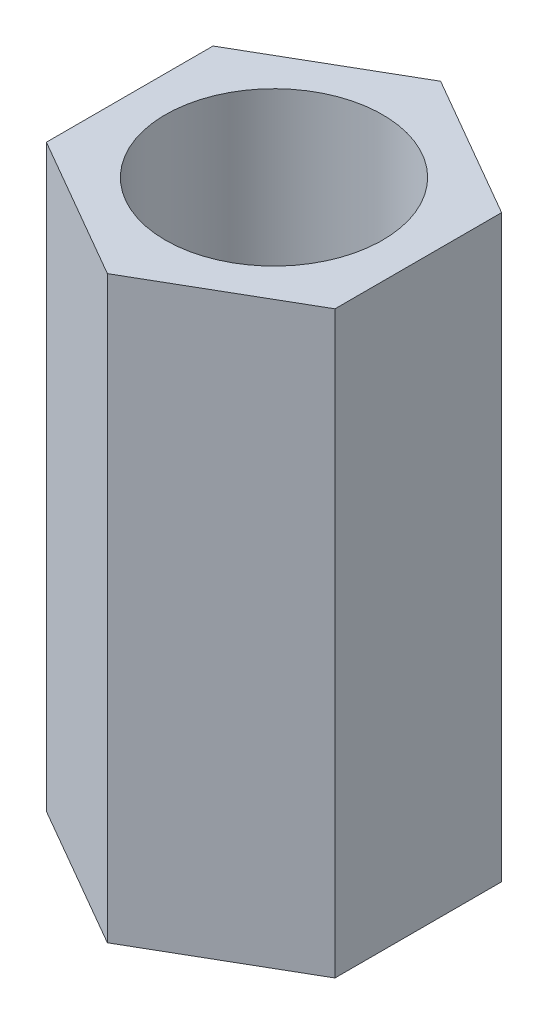
ISO-10303-21;
HEADER;
FILE_DESCRIPTION(('STEP AP214'),'2;1');
FILE_NAME('part.step','',(''),(''),'','','');
FILE_SCHEMA(('AUTOMOTIVE_DESIGN { 1 0 10303 214 1 1 1 1 }'));
ENDSEC;
DATA;
#1=APPLICATION_CONTEXT('core data for automotive mechanical design processes');
#2=APPLICATION_PROTOCOL_DEFINITION('international standard','automotive_design',2000,#1);
#3=PRODUCT_CONTEXT('',#1,'mechanical');
#4=PRODUCT('Part','Part','',(#3));
#5=PRODUCT_RELATED_PRODUCT_CATEGORY('part','',(#4));
#6=PRODUCT_DEFINITION_FORMATION('','',#4);
#7=PRODUCT_DEFINITION_CONTEXT('part definition',#1,'design');
#8=PRODUCT_DEFINITION('design','',#6,#7);
#9=PRODUCT_DEFINITION_SHAPE('','',#8);
#10=(LENGTH_UNIT() NAMED_UNIT(*) SI_UNIT(.MILLI.,.METRE.));
#11=(NAMED_UNIT(*) PLANE_ANGLE_UNIT() SI_UNIT($,.RADIAN.));
#12=(NAMED_UNIT(*) SI_UNIT($,.STERADIAN.) SOLID_ANGLE_UNIT());
#13=UNCERTAINTY_MEASURE_WITH_UNIT(LENGTH_MEASURE(1.E-05),#10,'distance_accuracy_value','');
#14=(GEOMETRIC_REPRESENTATION_CONTEXT(3) GLOBAL_UNCERTAINTY_ASSIGNED_CONTEXT((#13)) GLOBAL_UNIT_ASSIGNED_CONTEXT((#10,
#11,#12)) REPRESENTATION_CONTEXT('',''));
#15=CARTESIAN_POINT('',(0.,0.,0.));
#16=DIRECTION('',(0.,0.,1.));
#17=DIRECTION('',(1.,0.,0.));
#18=AXIS2_PLACEMENT_3D('',#15,#16,#17);
#19=CARTESIAN_POINT('',(0.,8.,0.));
#20=DIRECTION('',(0.,1.,0.));
#21=DIRECTION('',(0.,0.,1.));
#22=AXIS2_PLACEMENT_3D('',#19,#20,#21);
#23=PLANE('',#22);
#24=DIRECTION('',(0.,0.,-1.));
#25=VECTOR('',#24,1.);
#26=CARTESIAN_POINT('',(1.99185842870422,8.,1.14999999999998));
#27=LINE('',#26,#25);
#28=CARTESIAN_POINT('',(1.99185842870422,8.,1.14999999999998));
#29=VERTEX_POINT('',#28);
#30=CARTESIAN_POINT('',(1.9918584287042,8.,-1.15000000000002));
#31=VERTEX_POINT('',#30);
#32=EDGE_CURVE('E137',#29,#31,#27,.T.);
#33=ORIENTED_EDGE('',*,*,#32,.T.);
#34=DIRECTION('',(-0.866025403784443,0.,-0.499999999999992));
#35=VECTOR('',#34,1.);
#36=CARTESIAN_POINT('',(1.9918584287042,8.,-1.15000000000002));
#37=LINE('',#36,#35);
#38=CARTESIAN_POINT('',(0.,8.,-2.3));
#39=VERTEX_POINT('',#38);
#40=EDGE_CURVE('E95',#31,#39,#37,.T.);
#41=ORIENTED_EDGE('',*,*,#40,.T.);
#42=DIRECTION('',(-0.866025403784434,0.,0.500000000000008));
#43=VECTOR('',#42,1.);
#44=CARTESIAN_POINT('',(0.,8.,-2.3));
#45=LINE('',#44,#43);
#46=CARTESIAN_POINT('',(-1.99185842870422,8.,-1.14999999999998));
#47=VERTEX_POINT('',#46);
#48=EDGE_CURVE('E108',#39,#47,#45,.T.);
#49=ORIENTED_EDGE('',*,*,#48,.T.);
#50=DIRECTION('',(0.,0.,1.));
#51=VECTOR('',#50,1.);
#52=CARTESIAN_POINT('',(-1.99185842870422,8.,-1.14999999999998));
#53=LINE('',#52,#51);
#54=CARTESIAN_POINT('',(-1.9918584287042,8.,1.15000000000002));
#55=VERTEX_POINT('',#54);
#56=EDGE_CURVE('E102',#47,#55,#53,.T.);
#57=ORIENTED_EDGE('',*,*,#56,.T.);
#58=DIRECTION('',(0.866025403784443,0.,0.499999999999992));
#59=VECTOR('',#58,1.);
#60=CARTESIAN_POINT('',(-1.9918584287042,8.,1.15000000000002));
#61=LINE('',#60,#59);
#62=CARTESIAN_POINT('',(0.,8.,2.3));
#63=VERTEX_POINT('',#62);
#64=EDGE_CURVE('E106',#55,#63,#61,.T.);
#65=ORIENTED_EDGE('',*,*,#64,.T.);
#66=DIRECTION('',(0.866025403784434,0.,-0.500000000000008));
#67=VECTOR('',#66,1.);
#68=CARTESIAN_POINT('',(0.,8.,2.3));
#69=LINE('',#68,#67);
#70=EDGE_CURVE('E58',#63,#29,#69,.T.);
#71=ORIENTED_EDGE('',*,*,#70,.T.);
#72=EDGE_LOOP('',(#33,#41,#49,#57,#65,#71));
#73=FACE_BOUND('',#72,.T.);
#74=CARTESIAN_POINT('',(0.,8.,0.));
#75=DIRECTION('',(0.,1.,0.));
#76=DIRECTION('',(0.,0.,1.));
#77=AXIS2_PLACEMENT_3D('',#74,#75,#76);
#78=CIRCLE('',#77,1.5);
#79=CARTESIAN_POINT('',(0.,8.,1.5));
#80=VERTEX_POINT('',#79);
#81=EDGE_CURVE('E130',#80,#80,#78,.T.);
#82=ORIENTED_EDGE('',*,*,#81,.F.);
#83=EDGE_LOOP('',(#82));
#84=FACE_BOUND('',#83,.T.);
#85=ADVANCED_FACE('F41',(#73,#84),#23,.T.);
#86=CARTESIAN_POINT('',(0.,0.,0.));
#87=DIRECTION('',(0.,1.,0.));
#88=DIRECTION('',(0.,0.,1.));
#89=AXIS2_PLACEMENT_3D('',#86,#87,#88);
#90=PLANE('',#89);
#91=DIRECTION('',(0.,0.,-1.));
#92=VECTOR('',#91,1.);
#93=CARTESIAN_POINT('',(1.99185842870422,0.,1.14999999999998));
#94=LINE('',#93,#92);
#95=CARTESIAN_POINT('',(1.99185842870422,0.,1.14999999999998));
#96=VERTEX_POINT('',#95);
#97=CARTESIAN_POINT('',(1.9918584287042,0.,-1.15000000000002));
#98=VERTEX_POINT('',#97);
#99=EDGE_CURVE('E126',#96,#98,#94,.T.);
#100=ORIENTED_EDGE('',*,*,#99,.F.);
#101=DIRECTION('',(0.866025403784434,0.,-0.500000000000008));
#102=VECTOR('',#101,1.);
#103=CARTESIAN_POINT('',(0.,0.,2.3));
#104=LINE('',#103,#102);
#105=CARTESIAN_POINT('',(0.,0.,2.3));
#106=VERTEX_POINT('',#105);
#107=EDGE_CURVE('E87',#106,#96,#104,.T.);
#108=ORIENTED_EDGE('',*,*,#107,.F.);
#109=DIRECTION('',(0.866025403784443,0.,0.499999999999992));
#110=VECTOR('',#109,1.);
#111=CARTESIAN_POINT('',(-1.9918584287042,0.,1.15000000000002));
#112=LINE('',#111,#110);
#113=CARTESIAN_POINT('',(-1.9918584287042,0.,1.15000000000002));
#114=VERTEX_POINT('',#113);
#115=EDGE_CURVE('E81',#114,#106,#112,.T.);
#116=ORIENTED_EDGE('',*,*,#115,.F.);
#117=DIRECTION('',(0.,0.,1.));
#118=VECTOR('',#117,1.);
#119=CARTESIAN_POINT('',(-1.99185842870422,0.,-1.14999999999998));
#120=LINE('',#119,#118);
#121=CARTESIAN_POINT('',(-1.99185842870422,0.,-1.14999999999998));
#122=VERTEX_POINT('',#121);
#123=EDGE_CURVE('E116',#122,#114,#120,.T.);
#124=ORIENTED_EDGE('',*,*,#123,.F.);
#125=DIRECTION('',(-0.866025403784434,0.,0.500000000000008));
#126=VECTOR('',#125,1.);
#127=CARTESIAN_POINT('',(0.,0.,-2.3));
#128=LINE('',#127,#126);
#129=CARTESIAN_POINT('',(0.,0.,-2.3));
#130=VERTEX_POINT('',#129);
#131=EDGE_CURVE('E132',#130,#122,#128,.T.);
#132=ORIENTED_EDGE('',*,*,#131,.F.);
#133=DIRECTION('',(-0.866025403784443,0.,-0.499999999999992));
#134=VECTOR('',#133,1.);
#135=CARTESIAN_POINT('',(1.9918584287042,0.,-1.15000000000002));
#136=LINE('',#135,#134);
#137=EDGE_CURVE('E129',#98,#130,#136,.T.);
#138=ORIENTED_EDGE('',*,*,#137,.F.);
#139=EDGE_LOOP('',(#100,#108,#116,#124,#132,#138));
#140=FACE_BOUND('',#139,.T.);
#141=CARTESIAN_POINT('',(0.,0.,0.));
#142=DIRECTION('',(0.,1.,0.));
#143=DIRECTION('',(0.,0.,1.));
#144=AXIS2_PLACEMENT_3D('',#141,#142,#143);
#145=CIRCLE('',#144,1.5);
#146=CARTESIAN_POINT('',(0.,0.,1.5));
#147=VERTEX_POINT('',#146);
#148=EDGE_CURVE('E230',#147,#147,#145,.T.);
#149=ORIENTED_EDGE('',*,*,#148,.T.);
#150=EDGE_LOOP('',(#149));
#151=FACE_BOUND('',#150,.T.);
#152=ADVANCED_FACE('F146',(#140,#151),#90,.F.);
#153=CARTESIAN_POINT('',(1.99185842870422,8.,1.14999999999998));
#154=DIRECTION('',(-1.,0.,0.));
#155=DIRECTION('',(0.,0.,1.));
#156=AXIS2_PLACEMENT_3D('',#153,#154,#155);
#157=PLANE('',#156);
#158=ORIENTED_EDGE('',*,*,#99,.T.);
#159=DIRECTION('',(0.,-1.,0.));
#160=VECTOR('',#159,1.);
#161=CARTESIAN_POINT('',(1.9918584287042,8.,-1.15000000000002));
#162=LINE('',#161,#160);
#163=EDGE_CURVE('E11',#31,#98,#162,.T.);
#164=ORIENTED_EDGE('',*,*,#163,.F.);
#165=ORIENTED_EDGE('',*,*,#32,.F.);
#166=DIRECTION('',(0.,-1.,0.));
#167=VECTOR('',#166,1.);
#168=CARTESIAN_POINT('',(1.99185842870422,8.,1.14999999999998));
#169=LINE('',#168,#167);
#170=EDGE_CURVE('E122',#29,#96,#169,.T.);
#171=ORIENTED_EDGE('',*,*,#170,.T.);
#172=EDGE_LOOP('',(#158,#164,#165,#171));
#173=FACE_BOUND('',#172,.T.);
#174=ADVANCED_FACE('F43',(#173),#157,.F.);
#175=CARTESIAN_POINT('',(1.9918584287042,8.,-1.15000000000002));
#176=DIRECTION('',(-0.499999999999992,0.,0.866025403784443));
#177=DIRECTION('',(0.866025403784443,0.,0.499999999999992));
#178=AXIS2_PLACEMENT_3D('',#175,#176,#177);
#179=PLANE('',#178);
#180=ORIENTED_EDGE('',*,*,#137,.T.);
#181=DIRECTION('',(0.,-1.,0.));
#182=VECTOR('',#181,1.);
#183=CARTESIAN_POINT('',(0.,8.,-2.3));
#184=LINE('',#183,#182);
#185=EDGE_CURVE('E50',#39,#130,#184,.T.);
#186=ORIENTED_EDGE('',*,*,#185,.F.);
#187=ORIENTED_EDGE('',*,*,#40,.F.);
#188=ORIENTED_EDGE('',*,*,#163,.T.);
#189=EDGE_LOOP('',(#180,#186,#187,#188));
#190=FACE_BOUND('',#189,.T.);
#191=ADVANCED_FACE('F171',(#190),#179,.F.);
#192=CARTESIAN_POINT('',(0.,8.,-2.3));
#193=DIRECTION('',(0.500000000000008,0.,0.866025403784434));
#194=DIRECTION('',(0.866025403784434,0.,-0.500000000000008));
#195=AXIS2_PLACEMENT_3D('',#192,#193,#194);
#196=PLANE('',#195);
#197=ORIENTED_EDGE('',*,*,#131,.T.);
#198=DIRECTION('',(0.,-1.,0.));
#199=VECTOR('',#198,1.);
#200=CARTESIAN_POINT('',(-1.99185842870422,8.,-1.14999999999998));
#201=LINE('',#200,#199);
#202=EDGE_CURVE('E117',#47,#122,#201,.T.);
#203=ORIENTED_EDGE('',*,*,#202,.F.);
#204=ORIENTED_EDGE('',*,*,#48,.F.);
#205=ORIENTED_EDGE('',*,*,#185,.T.);
#206=EDGE_LOOP('',(#197,#203,#204,#205));
#207=FACE_BOUND('',#206,.T.);
#208=ADVANCED_FACE('F143',(#207),#196,.F.);
#209=CARTESIAN_POINT('',(-1.99185842870422,8.,-1.14999999999998));
#210=DIRECTION('',(1.,0.,0.));
#211=DIRECTION('',(0.,0.,-1.));
#212=AXIS2_PLACEMENT_3D('',#209,#210,#211);
#213=PLANE('',#212);
#214=ORIENTED_EDGE('',*,*,#123,.T.);
#215=DIRECTION('',(0.,-1.,0.));
#216=VECTOR('',#215,1.);
#217=CARTESIAN_POINT('',(-1.9918584287042,8.,1.15000000000002));
#218=LINE('',#217,#216);
#219=EDGE_CURVE('E113',#55,#114,#218,.T.);
#220=ORIENTED_EDGE('',*,*,#219,.F.);
#221=ORIENTED_EDGE('',*,*,#56,.F.);
#222=ORIENTED_EDGE('',*,*,#202,.T.);
#223=EDGE_LOOP('',(#214,#220,#221,#222));
#224=FACE_BOUND('',#223,.T.);
#225=ADVANCED_FACE('F114',(#224),#213,.F.);
#226=CARTESIAN_POINT('',(-1.9918584287042,8.,1.15000000000002));
#227=DIRECTION('',(0.499999999999992,0.,-0.866025403784443));
#228=DIRECTION('',(-0.866025403784443,0.,-0.499999999999992));
#229=AXIS2_PLACEMENT_3D('',#226,#227,#228);
#230=PLANE('',#229);
#231=ORIENTED_EDGE('',*,*,#115,.T.);
#232=DIRECTION('',(0.,-1.,0.));
#233=VECTOR('',#232,1.);
#234=CARTESIAN_POINT('',(0.,8.,2.3));
#235=LINE('',#234,#233);
#236=EDGE_CURVE('E118',#63,#106,#235,.T.);
#237=ORIENTED_EDGE('',*,*,#236,.F.);
#238=ORIENTED_EDGE('',*,*,#64,.F.);
#239=ORIENTED_EDGE('',*,*,#219,.T.);
#240=EDGE_LOOP('',(#231,#237,#238,#239));
#241=FACE_BOUND('',#240,.T.);
#242=ADVANCED_FACE('F120',(#241),#230,.F.);
#243=CARTESIAN_POINT('',(0.,8.,2.3));
#244=DIRECTION('',(-0.500000000000008,0.,-0.866025403784434));
#245=DIRECTION('',(-0.866025403784434,0.,0.500000000000008));
#246=AXIS2_PLACEMENT_3D('',#243,#244,#245);
#247=PLANE('',#246);
#248=ORIENTED_EDGE('',*,*,#107,.T.);
#249=ORIENTED_EDGE('',*,*,#170,.F.);
#250=ORIENTED_EDGE('',*,*,#70,.F.);
#251=ORIENTED_EDGE('',*,*,#236,.T.);
#252=EDGE_LOOP('',(#248,#249,#250,#251));
#253=FACE_BOUND('',#252,.T.);
#254=ADVANCED_FACE('F151',(#253),#247,.F.);
#255=CARTESIAN_POINT('',(0.,8.,0.));
#256=DIRECTION('',(0.,-1.,0.));
#257=DIRECTION('',(0.,0.,-1.));
#258=AXIS2_PLACEMENT_3D('',#255,#256,#257);
#259=CYLINDRICAL_SURFACE('',#258,1.5);
#260=ORIENTED_EDGE('',*,*,#81,.T.);
#261=EDGE_LOOP('',(#260));
#262=FACE_BOUND('',#261,.T.);
#263=ORIENTED_EDGE('',*,*,#148,.F.);
#264=EDGE_LOOP('',(#263));
#265=FACE_BOUND('',#264,.T.);
#266=ADVANCED_FACE('F153',(#262,#265),#259,.F.);
#267=CLOSED_SHELL('',(#85,#152,#174,#191,#208,#225,#242,#254,#266));
#268=MANIFOLD_SOLID_BREP('B2',#267);
#269=ADVANCED_BREP_SHAPE_REPRESENTATION('',(#18,#268),#14);
#270=SHAPE_DEFINITION_REPRESENTATION(#9,#269);
ENDSEC;
END-ISO-10303-21;
